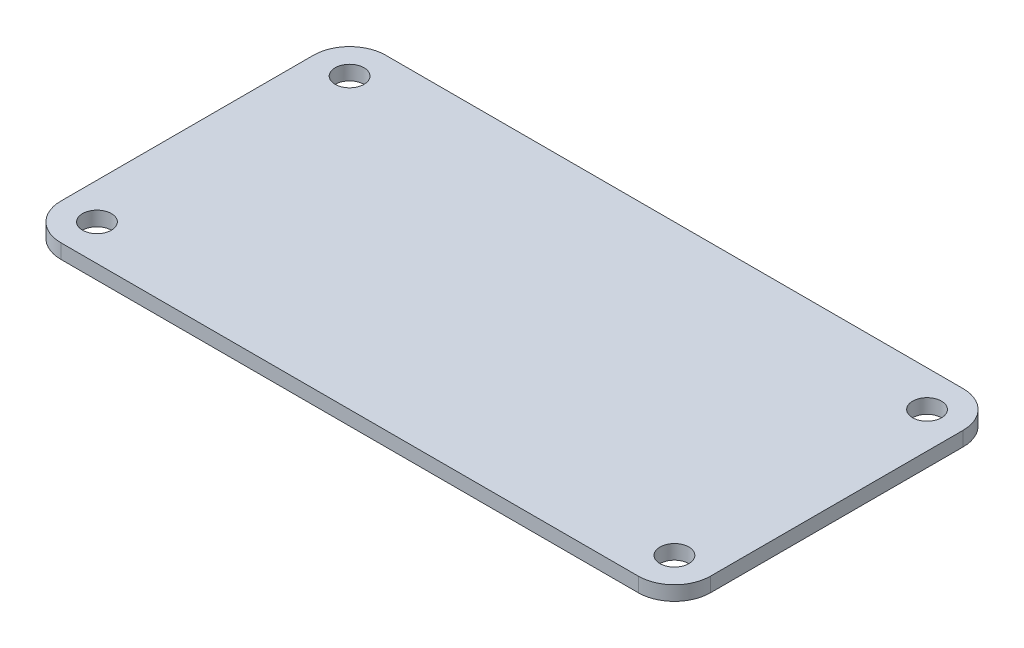
ISO-10303-21;
HEADER;
FILE_DESCRIPTION(('STEP AP214'),'2;1');
FILE_NAME('part.step','',(''),(''),'','','');
FILE_SCHEMA(('AUTOMOTIVE_DESIGN { 1 0 10303 214 1 1 1 1 }'));
ENDSEC;
DATA;
#1=APPLICATION_CONTEXT('core data for automotive mechanical design processes');
#2=APPLICATION_PROTOCOL_DEFINITION('international standard','automotive_design',2000,#1);
#3=PRODUCT_CONTEXT('',#1,'mechanical');
#4=PRODUCT('Part','Part','',(#3));
#5=PRODUCT_RELATED_PRODUCT_CATEGORY('part','',(#4));
#6=PRODUCT_DEFINITION_FORMATION('','',#4);
#7=PRODUCT_DEFINITION_CONTEXT('part definition',#1,'design');
#8=PRODUCT_DEFINITION('design','',#6,#7);
#9=PRODUCT_DEFINITION_SHAPE('','',#8);
#10=(LENGTH_UNIT() NAMED_UNIT(*) SI_UNIT(.MILLI.,.METRE.));
#11=(NAMED_UNIT(*) PLANE_ANGLE_UNIT() SI_UNIT($,.RADIAN.));
#12=(NAMED_UNIT(*) SI_UNIT($,.STERADIAN.) SOLID_ANGLE_UNIT());
#13=UNCERTAINTY_MEASURE_WITH_UNIT(LENGTH_MEASURE(1.E-05),#10,'distance_accuracy_value','');
#14=(GEOMETRIC_REPRESENTATION_CONTEXT(3) GLOBAL_UNCERTAINTY_ASSIGNED_CONTEXT((#13)) GLOBAL_UNIT_ASSIGNED_CONTEXT((#10,
#11,#12)) REPRESENTATION_CONTEXT('',''));
#15=CARTESIAN_POINT('',(0.,0.,0.));
#16=DIRECTION('',(0.,0.,1.));
#17=DIRECTION('',(1.,0.,0.));
#18=AXIS2_PLACEMENT_3D('',#15,#16,#17);
#19=CARTESIAN_POINT('',(90.,4.,45.));
#20=DIRECTION('',(-1.,0.,0.));
#21=DIRECTION('',(0.,0.,1.));
#22=AXIS2_PLACEMENT_3D('',#19,#20,#21);
#23=PLANE('',#22);
#24=DIRECTION('',(0.,0.,-1.));
#25=VECTOR('',#24,1.);
#26=CARTESIAN_POINT('',(90.,4.,45.));
#27=LINE('',#26,#25);
#28=CARTESIAN_POINT('',(90.,4.,35.));
#29=VERTEX_POINT('',#28);
#30=CARTESIAN_POINT('',(90.,4.,-35.));
#31=VERTEX_POINT('',#30);
#32=EDGE_CURVE('E121',#29,#31,#27,.T.);
#33=ORIENTED_EDGE('',*,*,#32,.F.);
#34=DIRECTION('',(0.,-1.,0.));
#35=VECTOR('',#34,1.);
#36=CARTESIAN_POINT('',(90.,4.,35.));
#37=LINE('',#36,#35);
#38=CARTESIAN_POINT('',(90.,0.,35.));
#39=VERTEX_POINT('',#38);
#40=EDGE_CURVE('E106',#29,#39,#37,.T.);
#41=ORIENTED_EDGE('',*,*,#40,.T.);
#42=DIRECTION('',(0.,0.,-1.));
#43=VECTOR('',#42,1.);
#44=CARTESIAN_POINT('',(90.,0.,45.));
#45=LINE('',#44,#43);
#46=CARTESIAN_POINT('',(90.,0.,-35.));
#47=VERTEX_POINT('',#46);
#48=EDGE_CURVE('E118',#39,#47,#45,.T.);
#49=ORIENTED_EDGE('',*,*,#48,.T.);
#50=DIRECTION('',(0.,-1.,0.));
#51=VECTOR('',#50,1.);
#52=CARTESIAN_POINT('',(90.,4.,-35.));
#53=LINE('',#52,#51);
#54=EDGE_CURVE('E123',#47,#31,#53,.F.);
#55=ORIENTED_EDGE('',*,*,#54,.T.);
#56=EDGE_LOOP('',(#33,#41,#49,#55));
#57=FACE_BOUND('',#56,.T.);
#58=ADVANCED_FACE('F36',(#57),#23,.F.);
#59=CARTESIAN_POINT('',(-90.,4.,-45.));
#60=DIRECTION('',(0.,0.,1.));
#61=DIRECTION('',(1.,0.,0.));
#62=AXIS2_PLACEMENT_3D('',#59,#60,#61);
#63=PLANE('',#62);
#64=DIRECTION('',(-1.,0.,0.));
#65=VECTOR('',#64,1.);
#66=CARTESIAN_POINT('',(-90.,4.,-45.));
#67=LINE('',#66,#65);
#68=CARTESIAN_POINT('',(79.9999999999999,4.,-45.));
#69=VERTEX_POINT('',#68);
#70=CARTESIAN_POINT('',(-80.,4.,-45.));
#71=VERTEX_POINT('',#70);
#72=EDGE_CURVE('E167',#69,#71,#67,.T.);
#73=ORIENTED_EDGE('',*,*,#72,.F.);
#74=DIRECTION('',(0.,-1.,0.));
#75=VECTOR('',#74,1.);
#76=CARTESIAN_POINT('',(80.,4.,-45.));
#77=LINE('',#76,#75);
#78=CARTESIAN_POINT('',(79.9999999999999,0.,-45.));
#79=VERTEX_POINT('',#78);
#80=EDGE_CURVE('E160',#69,#79,#77,.T.);
#81=ORIENTED_EDGE('',*,*,#80,.T.);
#82=DIRECTION('',(-1.,0.,0.));
#83=VECTOR('',#82,1.);
#84=CARTESIAN_POINT('',(-90.,0.,-45.));
#85=LINE('',#84,#83);
#86=CARTESIAN_POINT('',(-80.,0.,-45.));
#87=VERTEX_POINT('',#86);
#88=EDGE_CURVE('E127',#79,#87,#85,.T.);
#89=ORIENTED_EDGE('',*,*,#88,.T.);
#90=DIRECTION('',(0.,-1.,0.));
#91=VECTOR('',#90,1.);
#92=CARTESIAN_POINT('',(-80.,4.,-45.));
#93=LINE('',#92,#91);
#94=EDGE_CURVE('E158',#87,#71,#93,.F.);
#95=ORIENTED_EDGE('',*,*,#94,.T.);
#96=EDGE_LOOP('',(#73,#81,#89,#95));
#97=FACE_BOUND('',#96,.T.);
#98=ADVANCED_FACE('F165',(#97),#63,.F.);
#99=CARTESIAN_POINT('',(-90.,4.,45.));
#100=DIRECTION('',(1.,0.,0.));
#101=DIRECTION('',(0.,0.,-1.));
#102=AXIS2_PLACEMENT_3D('',#99,#100,#101);
#103=PLANE('',#102);
#104=DIRECTION('',(0.,0.,1.));
#105=VECTOR('',#104,1.);
#106=CARTESIAN_POINT('',(-90.,4.,45.));
#107=LINE('',#106,#105);
#108=CARTESIAN_POINT('',(-90.,4.,-35.));
#109=VERTEX_POINT('',#108);
#110=CARTESIAN_POINT('',(-90.,4.,35.));
#111=VERTEX_POINT('',#110);
#112=EDGE_CURVE('E175',#109,#111,#107,.T.);
#113=ORIENTED_EDGE('',*,*,#112,.F.);
#114=DIRECTION('',(0.,-1.,0.));
#115=VECTOR('',#114,1.);
#116=CARTESIAN_POINT('',(-90.,4.,-35.));
#117=LINE('',#116,#115);
#118=CARTESIAN_POINT('',(-90.,0.,-35.));
#119=VERTEX_POINT('',#118);
#120=EDGE_CURVE('E11',#109,#119,#117,.T.);
#121=ORIENTED_EDGE('',*,*,#120,.T.);
#122=DIRECTION('',(0.,0.,1.));
#123=VECTOR('',#122,1.);
#124=CARTESIAN_POINT('',(-90.,0.,45.));
#125=LINE('',#124,#123);
#126=CARTESIAN_POINT('',(-90.,0.,35.));
#127=VERTEX_POINT('',#126);
#128=EDGE_CURVE('E131',#119,#127,#125,.T.);
#129=ORIENTED_EDGE('',*,*,#128,.T.);
#130=DIRECTION('',(0.,-1.,0.));
#131=VECTOR('',#130,1.);
#132=CARTESIAN_POINT('',(-90.,4.,35.));
#133=LINE('',#132,#131);
#134=EDGE_CURVE('E44',#127,#111,#133,.F.);
#135=ORIENTED_EDGE('',*,*,#134,.T.);
#136=EDGE_LOOP('',(#113,#121,#129,#135));
#137=FACE_BOUND('',#136,.T.);
#138=ADVANCED_FACE('F174',(#137),#103,.F.);
#139=CARTESIAN_POINT('',(-90.,4.,45.));
#140=DIRECTION('',(0.,0.,-1.));
#141=DIRECTION('',(-1.,0.,0.));
#142=AXIS2_PLACEMENT_3D('',#139,#140,#141);
#143=PLANE('',#142);
#144=DIRECTION('',(1.,0.,0.));
#145=VECTOR('',#144,1.);
#146=CARTESIAN_POINT('',(-90.,0.,45.));
#147=LINE('',#146,#145);
#148=CARTESIAN_POINT('',(-80.,0.,45.));
#149=VERTEX_POINT('',#148);
#150=CARTESIAN_POINT('',(79.9999999999999,0.,45.));
#151=VERTEX_POINT('',#150);
#152=EDGE_CURVE('E141',#149,#151,#147,.T.);
#153=ORIENTED_EDGE('',*,*,#152,.T.);
#154=DIRECTION('',(0.,-1.,0.));
#155=VECTOR('',#154,1.);
#156=CARTESIAN_POINT('',(80.,4.,45.));
#157=LINE('',#156,#155);
#158=CARTESIAN_POINT('',(79.9999999999999,4.,45.));
#159=VERTEX_POINT('',#158);
#160=EDGE_CURVE('E107',#151,#159,#157,.F.);
#161=ORIENTED_EDGE('',*,*,#160,.T.);
#162=DIRECTION('',(1.,0.,0.));
#163=VECTOR('',#162,1.);
#164=CARTESIAN_POINT('',(-90.,4.,45.));
#165=LINE('',#164,#163);
#166=CARTESIAN_POINT('',(-80.,4.,45.));
#167=VERTEX_POINT('',#166);
#168=EDGE_CURVE('E137',#167,#159,#165,.T.);
#169=ORIENTED_EDGE('',*,*,#168,.F.);
#170=DIRECTION('',(0.,-1.,0.));
#171=VECTOR('',#170,1.);
#172=CARTESIAN_POINT('',(-80.,4.,45.));
#173=LINE('',#172,#171);
#174=EDGE_CURVE('E112',#167,#149,#173,.T.);
#175=ORIENTED_EDGE('',*,*,#174,.T.);
#176=EDGE_LOOP('',(#153,#161,#169,#175));
#177=FACE_BOUND('',#176,.T.);
#178=ADVANCED_FACE('F207',(#177),#143,.F.);
#179=CARTESIAN_POINT('',(0.,4.,0.));
#180=DIRECTION('',(0.,-1.,0.));
#181=DIRECTION('',(0.,0.,-1.));
#182=AXIS2_PLACEMENT_3D('',#179,#180,#181);
#183=PLANE('',#182);
#184=CARTESIAN_POINT('',(80.,4.,-35.));
#185=DIRECTION('',(0.,1.,0.));
#186=DIRECTION('',(0.,0.,-1.));
#187=AXIS2_PLACEMENT_3D('',#184,#185,#186);
#188=CIRCLE('',#187,4.00000000000001);
#189=CARTESIAN_POINT('',(80.,4.,-39.));
#190=VERTEX_POINT('',#189);
#191=EDGE_CURVE('E187',#190,#190,#188,.T.);
#192=ORIENTED_EDGE('',*,*,#191,.F.);
#193=EDGE_LOOP('',(#192));
#194=FACE_BOUND('',#193,.T.);
#195=CARTESIAN_POINT('',(80.,4.,35.));
#196=DIRECTION('',(0.,1.,0.));
#197=DIRECTION('',(0.,0.,-1.));
#198=AXIS2_PLACEMENT_3D('',#195,#196,#197);
#199=CIRCLE('',#198,4.00000000000001);
#200=CARTESIAN_POINT('',(80.,4.,31.));
#201=VERTEX_POINT('',#200);
#202=EDGE_CURVE('E193',#201,#201,#199,.T.);
#203=ORIENTED_EDGE('',*,*,#202,.F.);
#204=EDGE_LOOP('',(#203));
#205=FACE_BOUND('',#204,.T.);
#206=CARTESIAN_POINT('',(-80.,4.,35.));
#207=DIRECTION('',(0.,1.,0.));
#208=DIRECTION('',(0.,0.,1.));
#209=AXIS2_PLACEMENT_3D('',#206,#207,#208);
#210=CIRCLE('',#209,4.00000000000001);
#211=CARTESIAN_POINT('',(-80.,4.,39.));
#212=VERTEX_POINT('',#211);
#213=EDGE_CURVE('E182',#212,#212,#210,.T.);
#214=ORIENTED_EDGE('',*,*,#213,.F.);
#215=EDGE_LOOP('',(#214));
#216=FACE_BOUND('',#215,.T.);
#217=CARTESIAN_POINT('',(-80.,4.,-35.));
#218=DIRECTION('',(0.,1.,0.));
#219=DIRECTION('',(0.,0.,1.));
#220=AXIS2_PLACEMENT_3D('',#217,#218,#219);
#221=CIRCLE('',#220,4.00000000000001);
#222=CARTESIAN_POINT('',(-80.,4.,-31.));
#223=VERTEX_POINT('',#222);
#224=EDGE_CURVE('E128',#223,#223,#221,.T.);
#225=ORIENTED_EDGE('',*,*,#224,.F.);
#226=EDGE_LOOP('',(#225));
#227=FACE_BOUND('',#226,.T.);
#228=ORIENTED_EDGE('',*,*,#168,.T.);
#229=CARTESIAN_POINT('',(80.,4.,35.));
#230=DIRECTION('',(0.,-1.,0.));
#231=DIRECTION('',(0.,0.,-1.));
#232=AXIS2_PLACEMENT_3D('',#229,#230,#231);
#233=CIRCLE('',#232,10.);
#234=EDGE_CURVE('E156',#159,#29,#233,.F.);
#235=ORIENTED_EDGE('',*,*,#234,.T.);
#236=ORIENTED_EDGE('',*,*,#32,.T.);
#237=CARTESIAN_POINT('',(80.,4.,-35.));
#238=DIRECTION('',(0.,-1.,0.));
#239=DIRECTION('',(0.,0.,-1.));
#240=AXIS2_PLACEMENT_3D('',#237,#238,#239);
#241=CIRCLE('',#240,10.);
#242=EDGE_CURVE('E154',#31,#69,#241,.F.);
#243=ORIENTED_EDGE('',*,*,#242,.T.);
#244=ORIENTED_EDGE('',*,*,#72,.T.);
#245=CARTESIAN_POINT('',(-80.,4.,-35.));
#246=DIRECTION('',(0.,-1.,0.));
#247=DIRECTION('',(0.,0.,-1.));
#248=AXIS2_PLACEMENT_3D('',#245,#246,#247);
#249=CIRCLE('',#248,10.);
#250=EDGE_CURVE('E57',#71,#109,#249,.F.);
#251=ORIENTED_EDGE('',*,*,#250,.T.);
#252=ORIENTED_EDGE('',*,*,#112,.T.);
#253=CARTESIAN_POINT('',(-80.,4.,35.));
#254=DIRECTION('',(0.,-1.,0.));
#255=DIRECTION('',(0.,0.,-1.));
#256=AXIS2_PLACEMENT_3D('',#253,#254,#255);
#257=CIRCLE('',#256,10.);
#258=EDGE_CURVE('E151',#111,#167,#257,.F.);
#259=ORIENTED_EDGE('',*,*,#258,.T.);
#260=EDGE_LOOP('',(#228,#235,#236,#243,#244,#251,#252,#259));
#261=FACE_BOUND('',#260,.T.);
#262=ADVANCED_FACE('F204',(#194,#205,#216,#227,#261),#183,.F.);
#263=CARTESIAN_POINT('',(0.,0.,0.));
#264=DIRECTION('',(0.,-1.,0.));
#265=DIRECTION('',(0.,0.,-1.));
#266=AXIS2_PLACEMENT_3D('',#263,#264,#265);
#267=PLANE('',#266);
#268=CARTESIAN_POINT('',(80.,0.,-35.));
#269=DIRECTION('',(0.,-1.,0.));
#270=DIRECTION('',(0.,0.,-1.));
#271=AXIS2_PLACEMENT_3D('',#268,#269,#270);
#272=CIRCLE('',#271,4.00000000000001);
#273=CARTESIAN_POINT('',(80.,0.,-39.));
#274=VERTEX_POINT('',#273);
#275=EDGE_CURVE('E184',#274,#274,#272,.F.);
#276=ORIENTED_EDGE('',*,*,#275,.T.);
#277=EDGE_LOOP('',(#276));
#278=FACE_BOUND('',#277,.T.);
#279=CARTESIAN_POINT('',(80.,0.,35.));
#280=DIRECTION('',(0.,-1.,0.));
#281=DIRECTION('',(0.,0.,-1.));
#282=AXIS2_PLACEMENT_3D('',#279,#280,#281);
#283=CIRCLE('',#282,4.00000000000001);
#284=CARTESIAN_POINT('',(80.,0.,31.));
#285=VERTEX_POINT('',#284);
#286=EDGE_CURVE('E190',#285,#285,#283,.F.);
#287=ORIENTED_EDGE('',*,*,#286,.T.);
#288=EDGE_LOOP('',(#287));
#289=FACE_BOUND('',#288,.T.);
#290=CARTESIAN_POINT('',(-80.,0.,35.));
#291=DIRECTION('',(0.,-1.,0.));
#292=DIRECTION('',(0.,0.,-1.));
#293=AXIS2_PLACEMENT_3D('',#290,#291,#292);
#294=CIRCLE('',#293,4.00000000000001);
#295=CARTESIAN_POINT('',(-80.,0.,31.));
#296=VERTEX_POINT('',#295);
#297=EDGE_CURVE('E196',#296,#296,#294,.F.);
#298=ORIENTED_EDGE('',*,*,#297,.T.);
#299=EDGE_LOOP('',(#298));
#300=FACE_BOUND('',#299,.T.);
#301=CARTESIAN_POINT('',(-80.,0.,-35.));
#302=DIRECTION('',(0.,-1.,0.));
#303=DIRECTION('',(0.,0.,-1.));
#304=AXIS2_PLACEMENT_3D('',#301,#302,#303);
#305=CIRCLE('',#304,4.00000000000001);
#306=CARTESIAN_POINT('',(-80.,0.,-39.));
#307=VERTEX_POINT('',#306);
#308=EDGE_CURVE('E134',#307,#307,#305,.F.);
#309=ORIENTED_EDGE('',*,*,#308,.T.);
#310=EDGE_LOOP('',(#309));
#311=FACE_BOUND('',#310,.T.);
#312=ORIENTED_EDGE('',*,*,#48,.F.);
#313=CARTESIAN_POINT('',(80.,0.,35.));
#314=DIRECTION('',(0.,-1.,0.));
#315=DIRECTION('',(0.,0.,-1.));
#316=AXIS2_PLACEMENT_3D('',#313,#314,#315);
#317=CIRCLE('',#316,10.);
#318=EDGE_CURVE('E102',#39,#151,#317,.T.);
#319=ORIENTED_EDGE('',*,*,#318,.T.);
#320=ORIENTED_EDGE('',*,*,#152,.F.);
#321=CARTESIAN_POINT('',(-80.,0.,35.));
#322=DIRECTION('',(0.,-1.,0.));
#323=DIRECTION('',(0.,0.,-1.));
#324=AXIS2_PLACEMENT_3D('',#321,#322,#323);
#325=CIRCLE('',#324,10.);
#326=EDGE_CURVE('E122',#149,#127,#325,.T.);
#327=ORIENTED_EDGE('',*,*,#326,.T.);
#328=ORIENTED_EDGE('',*,*,#128,.F.);
#329=CARTESIAN_POINT('',(-80.,0.,-35.));
#330=DIRECTION('',(0.,-1.,0.));
#331=DIRECTION('',(0.,0.,-1.));
#332=AXIS2_PLACEMENT_3D('',#329,#330,#331);
#333=CIRCLE('',#332,10.);
#334=EDGE_CURVE('E145',#119,#87,#333,.T.);
#335=ORIENTED_EDGE('',*,*,#334,.T.);
#336=ORIENTED_EDGE('',*,*,#88,.F.);
#337=CARTESIAN_POINT('',(80.,0.,-35.));
#338=DIRECTION('',(0.,-1.,0.));
#339=DIRECTION('',(0.,0.,-1.));
#340=AXIS2_PLACEMENT_3D('',#337,#338,#339);
#341=CIRCLE('',#340,10.);
#342=EDGE_CURVE('E113',#79,#47,#341,.T.);
#343=ORIENTED_EDGE('',*,*,#342,.T.);
#344=EDGE_LOOP('',(#312,#319,#320,#327,#328,#335,#336,#343));
#345=FACE_BOUND('',#344,.T.);
#346=ADVANCED_FACE('F125',(#278,#289,#300,#311,#345),#267,.T.);
#347=CARTESIAN_POINT('',(80.,4.,35.));
#348=DIRECTION('',(0.,-1.,0.));
#349=DIRECTION('',(0.,0.,-1.));
#350=AXIS2_PLACEMENT_3D('',#347,#348,#349);
#351=CYLINDRICAL_SURFACE('',#350,10.);
#352=ORIENTED_EDGE('',*,*,#234,.F.);
#353=ORIENTED_EDGE('',*,*,#160,.F.);
#354=ORIENTED_EDGE('',*,*,#318,.F.);
#355=ORIENTED_EDGE('',*,*,#40,.F.);
#356=EDGE_LOOP('',(#352,#353,#354,#355));
#357=FACE_BOUND('',#356,.T.);
#358=ADVANCED_FACE('F105',(#357),#351,.T.);
#359=CARTESIAN_POINT('',(80.,4.,-35.));
#360=DIRECTION('',(0.,-1.,0.));
#361=DIRECTION('',(0.,0.,-1.));
#362=AXIS2_PLACEMENT_3D('',#359,#360,#361);
#363=CYLINDRICAL_SURFACE('',#362,10.);
#364=ORIENTED_EDGE('',*,*,#242,.F.);
#365=ORIENTED_EDGE('',*,*,#54,.F.);
#366=ORIENTED_EDGE('',*,*,#342,.F.);
#367=ORIENTED_EDGE('',*,*,#80,.F.);
#368=EDGE_LOOP('',(#364,#365,#366,#367));
#369=FACE_BOUND('',#368,.T.);
#370=ADVANCED_FACE('F223',(#369),#363,.T.);
#371=CARTESIAN_POINT('',(-80.,4.,-35.));
#372=DIRECTION('',(0.,-1.,0.));
#373=DIRECTION('',(0.,0.,-1.));
#374=AXIS2_PLACEMENT_3D('',#371,#372,#373);
#375=CYLINDRICAL_SURFACE('',#374,10.);
#376=ORIENTED_EDGE('',*,*,#250,.F.);
#377=ORIENTED_EDGE('',*,*,#94,.F.);
#378=ORIENTED_EDGE('',*,*,#334,.F.);
#379=ORIENTED_EDGE('',*,*,#120,.F.);
#380=EDGE_LOOP('',(#376,#377,#378,#379));
#381=FACE_BOUND('',#380,.T.);
#382=ADVANCED_FACE('F173',(#381),#375,.T.);
#383=CARTESIAN_POINT('',(-80.,4.,35.));
#384=DIRECTION('',(0.,-1.,0.));
#385=DIRECTION('',(0.,0.,-1.));
#386=AXIS2_PLACEMENT_3D('',#383,#384,#385);
#387=CYLINDRICAL_SURFACE('',#386,10.);
#388=ORIENTED_EDGE('',*,*,#258,.F.);
#389=ORIENTED_EDGE('',*,*,#134,.F.);
#390=ORIENTED_EDGE('',*,*,#326,.F.);
#391=ORIENTED_EDGE('',*,*,#174,.F.);
#392=EDGE_LOOP('',(#388,#389,#390,#391));
#393=FACE_BOUND('',#392,.T.);
#394=ADVANCED_FACE('F38',(#393),#387,.T.);
#395=CARTESIAN_POINT('',(-80.,-0.00100000000000013,-35.));
#396=DIRECTION('',(0.,1.,0.));
#397=DIRECTION('',(0.,0.,1.));
#398=AXIS2_PLACEMENT_3D('',#395,#396,#397);
#399=CYLINDRICAL_SURFACE('',#398,4.00000000000001);
#400=ORIENTED_EDGE('',*,*,#308,.F.);
#401=EDGE_LOOP('',(#400));
#402=FACE_BOUND('',#401,.T.);
#403=ORIENTED_EDGE('',*,*,#224,.T.);
#404=EDGE_LOOP('',(#403));
#405=FACE_BOUND('',#404,.T.);
#406=ADVANCED_FACE('F216',(#402,#405),#399,.F.);
#407=CARTESIAN_POINT('',(-80.,-0.00100000000000013,35.));
#408=DIRECTION('',(0.,1.,0.));
#409=DIRECTION('',(0.,0.,1.));
#410=AXIS2_PLACEMENT_3D('',#407,#408,#409);
#411=CYLINDRICAL_SURFACE('',#410,4.00000000000001);
#412=ORIENTED_EDGE('',*,*,#297,.F.);
#413=EDGE_LOOP('',(#412));
#414=FACE_BOUND('',#413,.T.);
#415=ORIENTED_EDGE('',*,*,#213,.T.);
#416=EDGE_LOOP('',(#415));
#417=FACE_BOUND('',#416,.T.);
#418=ADVANCED_FACE('F202',(#414,#417),#411,.F.);
#419=CARTESIAN_POINT('',(80.,-0.00100000000000013,35.));
#420=DIRECTION('',(0.,1.,0.));
#421=DIRECTION('',(0.,0.,1.));
#422=AXIS2_PLACEMENT_3D('',#419,#420,#421);
#423=CYLINDRICAL_SURFACE('',#422,4.00000000000001);
#424=ORIENTED_EDGE('',*,*,#286,.F.);
#425=EDGE_LOOP('',(#424));
#426=FACE_BOUND('',#425,.T.);
#427=ORIENTED_EDGE('',*,*,#202,.T.);
#428=EDGE_LOOP('',(#427));
#429=FACE_BOUND('',#428,.T.);
#430=ADVANCED_FACE('F280',(#426,#429),#423,.F.);
#431=CARTESIAN_POINT('',(80.,-0.00100000000000013,-35.));
#432=DIRECTION('',(0.,1.,0.));
#433=DIRECTION('',(0.,0.,1.));
#434=AXIS2_PLACEMENT_3D('',#431,#432,#433);
#435=CYLINDRICAL_SURFACE('',#434,4.00000000000001);
#436=ORIENTED_EDGE('',*,*,#275,.F.);
#437=EDGE_LOOP('',(#436));
#438=FACE_BOUND('',#437,.T.);
#439=ORIENTED_EDGE('',*,*,#191,.T.);
#440=EDGE_LOOP('',(#439));
#441=FACE_BOUND('',#440,.T.);
#442=ADVANCED_FACE('F290',(#438,#441),#435,.F.);
#443=CLOSED_SHELL('',(#58,#98,#138,#178,#262,#346,#358,#370,#382,#394,#406,#418,#430,#442));
#444=MANIFOLD_SOLID_BREP('B2',#443);
#445=ADVANCED_BREP_SHAPE_REPRESENTATION('',(#18,#444),#14);
#446=SHAPE_DEFINITION_REPRESENTATION(#9,#445);
ENDSEC;
END-ISO-10303-21;
